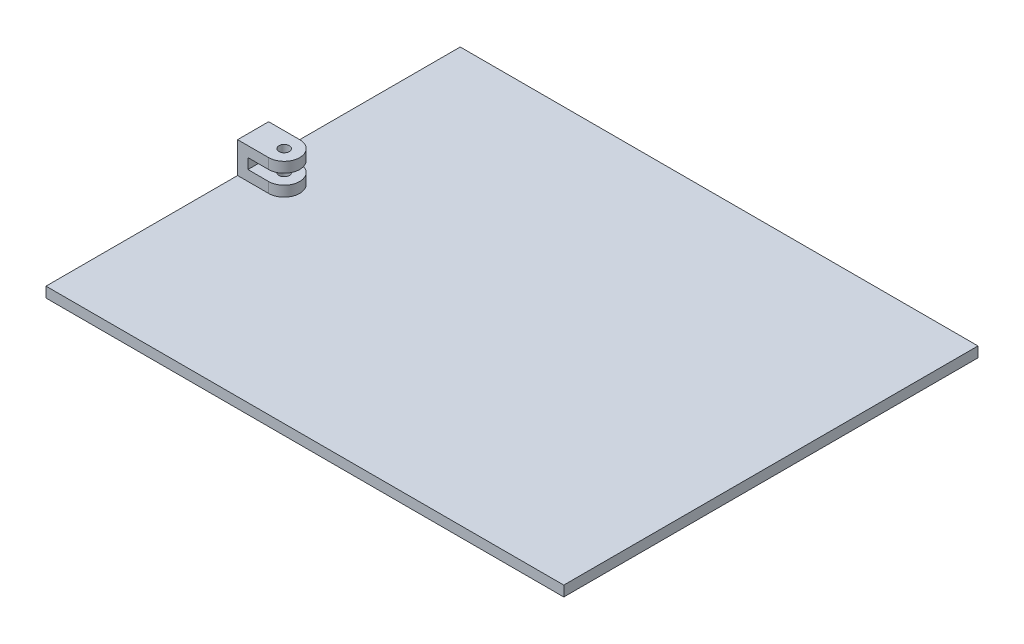
ISO-10303-21;
HEADER;
FILE_DESCRIPTION(('STEP AP214'),'2;1');
FILE_NAME('part.step','',(''),(''),'','','');
FILE_SCHEMA(('AUTOMOTIVE_DESIGN { 1 0 10303 214 1 1 1 1 }'));
ENDSEC;
DATA;
#1=APPLICATION_CONTEXT('core data for automotive mechanical design processes');
#2=APPLICATION_PROTOCOL_DEFINITION('international standard','automotive_design',2000,#1);
#3=PRODUCT_CONTEXT('',#1,'mechanical');
#4=PRODUCT('Part','Part','',(#3));
#5=PRODUCT_RELATED_PRODUCT_CATEGORY('part','',(#4));
#6=PRODUCT_DEFINITION_FORMATION('','',#4);
#7=PRODUCT_DEFINITION_CONTEXT('part definition',#1,'design');
#8=PRODUCT_DEFINITION('design','',#6,#7);
#9=PRODUCT_DEFINITION_SHAPE('','',#8);
#10=(LENGTH_UNIT() NAMED_UNIT(*) SI_UNIT(.MILLI.,.METRE.));
#11=(NAMED_UNIT(*) PLANE_ANGLE_UNIT() SI_UNIT($,.RADIAN.));
#12=(NAMED_UNIT(*) SI_UNIT($,.STERADIAN.) SOLID_ANGLE_UNIT());
#13=UNCERTAINTY_MEASURE_WITH_UNIT(LENGTH_MEASURE(1.E-05),#10,'distance_accuracy_value','');
#14=(GEOMETRIC_REPRESENTATION_CONTEXT(3) GLOBAL_UNCERTAINTY_ASSIGNED_CONTEXT((#13)) GLOBAL_UNIT_ASSIGNED_CONTEXT((#10,
#11,#12)) REPRESENTATION_CONTEXT('',''));
#15=CARTESIAN_POINT('',(0.,0.,0.));
#16=DIRECTION('',(0.,0.,1.));
#17=DIRECTION('',(1.,0.,0.));
#18=AXIS2_PLACEMENT_3D('',#15,#16,#17);
#19=CARTESIAN_POINT('',(0.,-10.,0.));
#20=DIRECTION('',(0.,1.,0.));
#21=DIRECTION('',(0.,0.,1.));
#22=AXIS2_PLACEMENT_3D('',#19,#20,#21);
#23=CYLINDRICAL_SURFACE('',#22,15.);
#24=CARTESIAN_POINT('',(0.,0.,0.));
#25=DIRECTION('',(0.,1.,0.));
#26=DIRECTION('',(0.,0.,1.));
#27=AXIS2_PLACEMENT_3D('',#24,#25,#26);
#28=CIRCLE('',#27,15.);
#29=CARTESIAN_POINT('',(0.,0.,15.));
#30=VERTEX_POINT('',#29);
#31=CARTESIAN_POINT('',(0.,0.,-15.));
#32=VERTEX_POINT('',#31);
#33=EDGE_CURVE('E199',#30,#32,#28,.T.);
#34=ORIENTED_EDGE('',*,*,#33,.F.);
#35=DIRECTION('',(0.,1.,0.));
#36=VECTOR('',#35,1.);
#37=CARTESIAN_POINT('',(0.,-10.,15.));
#38=LINE('',#37,#36);
#39=CARTESIAN_POINT('',(0.,-10.,15.));
#40=VERTEX_POINT('',#39);
#41=EDGE_CURVE('E11',#40,#30,#38,.T.);
#42=ORIENTED_EDGE('',*,*,#41,.F.);
#43=CARTESIAN_POINT('',(0.,-10.,0.));
#44=DIRECTION('',(0.,1.,0.));
#45=DIRECTION('',(0.,0.,1.));
#46=AXIS2_PLACEMENT_3D('',#43,#44,#45);
#47=CIRCLE('',#46,15.);
#48=CARTESIAN_POINT('',(0.,-10.,-15.));
#49=VERTEX_POINT('',#48);
#50=EDGE_CURVE('E202',#40,#49,#47,.T.);
#51=ORIENTED_EDGE('',*,*,#50,.T.);
#52=DIRECTION('',(0.,1.,0.));
#53=VECTOR('',#52,1.);
#54=CARTESIAN_POINT('',(0.,-10.,-15.));
#55=LINE('',#54,#53);
#56=EDGE_CURVE('E35',#49,#32,#55,.T.);
#57=ORIENTED_EDGE('',*,*,#56,.T.);
#58=EDGE_LOOP('',(#34,#42,#51,#57));
#59=FACE_BOUND('',#58,.T.);
#60=ADVANCED_FACE('F32',(#59),#23,.T.);
#61=CARTESIAN_POINT('',(-20.,-10.,15.));
#62=DIRECTION('',(0.,0.,1.));
#63=DIRECTION('',(1.,0.,0.));
#64=AXIS2_PLACEMENT_3D('',#61,#62,#63);
#65=PLANE('',#64);
#66=DIRECTION('',(1.,0.,0.));
#67=VECTOR('',#66,1.);
#68=CARTESIAN_POINT('',(-20.,0.,15.));
#69=LINE('',#68,#67);
#70=CARTESIAN_POINT('',(-30.,0.,15.));
#71=VERTEX_POINT('',#70);
#72=EDGE_CURVE('E205',#71,#30,#69,.T.);
#73=ORIENTED_EDGE('',*,*,#72,.F.);
#74=DIRECTION('',(0.,1.,0.));
#75=VECTOR('',#74,1.);
#76=CARTESIAN_POINT('',(-30.,0.,15.));
#77=LINE('',#76,#75);
#78=CARTESIAN_POINT('',(-30.,-30.,15.));
#79=VERTEX_POINT('',#78);
#80=EDGE_CURVE('E179',#79,#71,#77,.T.);
#81=ORIENTED_EDGE('',*,*,#80,.F.);
#82=DIRECTION('',(1.,0.,0.));
#83=VECTOR('',#82,1.);
#84=CARTESIAN_POINT('',(-30.,-30.,15.));
#85=LINE('',#84,#83);
#86=CARTESIAN_POINT('',(0.,-30.,15.));
#87=VERTEX_POINT('',#86);
#88=EDGE_CURVE('E187',#79,#87,#85,.T.);
#89=ORIENTED_EDGE('',*,*,#88,.T.);
#90=DIRECTION('',(0.,-1.,0.));
#91=VECTOR('',#90,1.);
#92=CARTESIAN_POINT('',(0.,-20.,15.));
#93=LINE('',#92,#91);
#94=CARTESIAN_POINT('',(0.,-20.,15.));
#95=VERTEX_POINT('',#94);
#96=EDGE_CURVE('E170',#95,#87,#93,.T.);
#97=ORIENTED_EDGE('',*,*,#96,.F.);
#98=DIRECTION('',(1.,0.,0.));
#99=VECTOR('',#98,1.);
#100=CARTESIAN_POINT('',(-20.,-20.,15.));
#101=LINE('',#100,#99);
#102=CARTESIAN_POINT('',(-20.,-20.,15.));
#103=VERTEX_POINT('',#102);
#104=EDGE_CURVE('E46',#103,#95,#101,.T.);
#105=ORIENTED_EDGE('',*,*,#104,.F.);
#106=DIRECTION('',(0.,1.,0.));
#107=VECTOR('',#106,1.);
#108=CARTESIAN_POINT('',(-20.,0.,15.));
#109=LINE('',#108,#107);
#110=CARTESIAN_POINT('',(-20.,-10.,15.));
#111=VERTEX_POINT('',#110);
#112=EDGE_CURVE('E178',#103,#111,#109,.T.);
#113=ORIENTED_EDGE('',*,*,#112,.T.);
#114=DIRECTION('',(1.,0.,0.));
#115=VECTOR('',#114,1.);
#116=CARTESIAN_POINT('',(-20.,-10.,15.));
#117=LINE('',#116,#115);
#118=EDGE_CURVE('E210',#111,#40,#117,.T.);
#119=ORIENTED_EDGE('',*,*,#118,.T.);
#120=ORIENTED_EDGE('',*,*,#41,.T.);
#121=EDGE_LOOP('',(#73,#81,#89,#97,#105,#113,#119,#120));
#122=FACE_BOUND('',#121,.T.);
#123=ADVANCED_FACE('F221',(#122),#65,.T.);
#124=CARTESIAN_POINT('',(0.,-10.,-15.));
#125=DIRECTION('',(0.,0.,-1.));
#126=DIRECTION('',(-1.,0.,0.));
#127=AXIS2_PLACEMENT_3D('',#124,#125,#126);
#128=PLANE('',#127);
#129=DIRECTION('',(-1.,0.,0.));
#130=VECTOR('',#129,1.);
#131=CARTESIAN_POINT('',(0.,0.,-15.));
#132=LINE('',#131,#130);
#133=CARTESIAN_POINT('',(-30.,0.,-15.));
#134=VERTEX_POINT('',#133);
#135=EDGE_CURVE('E214',#32,#134,#132,.T.);
#136=ORIENTED_EDGE('',*,*,#135,.F.);
#137=ORIENTED_EDGE('',*,*,#56,.F.);
#138=DIRECTION('',(-1.,0.,0.));
#139=VECTOR('',#138,1.);
#140=CARTESIAN_POINT('',(0.,-10.,-15.));
#141=LINE('',#140,#139);
#142=CARTESIAN_POINT('',(-20.,-10.,-15.));
#143=VERTEX_POINT('',#142);
#144=EDGE_CURVE('E204',#49,#143,#141,.T.);
#145=ORIENTED_EDGE('',*,*,#144,.T.);
#146=DIRECTION('',(0.,-1.,0.));
#147=VECTOR('',#146,1.);
#148=CARTESIAN_POINT('',(-20.,0.,-15.));
#149=LINE('',#148,#147);
#150=CARTESIAN_POINT('',(-20.,-20.,-15.));
#151=VERTEX_POINT('',#150);
#152=EDGE_CURVE('E182',#143,#151,#149,.T.);
#153=ORIENTED_EDGE('',*,*,#152,.T.);
#154=DIRECTION('',(-1.,0.,0.));
#155=VECTOR('',#154,1.);
#156=CARTESIAN_POINT('',(0.,-20.,-15.));
#157=LINE('',#156,#155);
#158=CARTESIAN_POINT('',(0.,-20.,-15.));
#159=VERTEX_POINT('',#158);
#160=EDGE_CURVE('E165',#159,#151,#157,.T.);
#161=ORIENTED_EDGE('',*,*,#160,.F.);
#162=DIRECTION('',(0.,-1.,0.));
#163=VECTOR('',#162,1.);
#164=CARTESIAN_POINT('',(0.,-20.,-15.));
#165=LINE('',#164,#163);
#166=CARTESIAN_POINT('',(0.,-30.,-15.));
#167=VERTEX_POINT('',#166);
#168=EDGE_CURVE('E175',#159,#167,#165,.T.);
#169=ORIENTED_EDGE('',*,*,#168,.T.);
#170=DIRECTION('',(1.,0.,0.));
#171=VECTOR('',#170,1.);
#172=CARTESIAN_POINT('',(-30.,-30.,-15.));
#173=LINE('',#172,#171);
#174=CARTESIAN_POINT('',(-30.,-30.,-15.));
#175=VERTEX_POINT('',#174);
#176=EDGE_CURVE('E193',#175,#167,#173,.T.);
#177=ORIENTED_EDGE('',*,*,#176,.F.);
#178=DIRECTION('',(0.,-1.,0.));
#179=VECTOR('',#178,1.);
#180=CARTESIAN_POINT('',(-30.,0.,-15.));
#181=LINE('',#180,#179);
#182=EDGE_CURVE('E185',#134,#175,#181,.T.);
#183=ORIENTED_EDGE('',*,*,#182,.F.);
#184=EDGE_LOOP('',(#136,#137,#145,#153,#161,#169,#177,#183));
#185=FACE_BOUND('',#184,.T.);
#186=ADVANCED_FACE('F258',(#185),#128,.T.);
#187=CARTESIAN_POINT('',(0.,-10.,0.));
#188=DIRECTION('',(0.,1.,0.));
#189=DIRECTION('',(0.,0.,1.));
#190=AXIS2_PLACEMENT_3D('',#187,#188,#189);
#191=PLANE('',#190);
#192=CARTESIAN_POINT('',(0.,-10.,0.));
#193=DIRECTION('',(0.,1.,0.));
#194=DIRECTION('',(0.,0.,1.));
#195=AXIS2_PLACEMENT_3D('',#192,#193,#194);
#196=CIRCLE('',#195,5.);
#197=CARTESIAN_POINT('',(0.,-10.,5.));
#198=VERTEX_POINT('',#197);
#199=EDGE_CURVE('E196',#198,#198,#196,.T.);
#200=ORIENTED_EDGE('',*,*,#199,.T.);
#201=EDGE_LOOP('',(#200));
#202=FACE_BOUND('',#201,.T.);
#203=ORIENTED_EDGE('',*,*,#50,.F.);
#204=ORIENTED_EDGE('',*,*,#118,.F.);
#205=DIRECTION('',(0.,0.,1.));
#206=VECTOR('',#205,1.);
#207=CARTESIAN_POINT('',(-20.,-10.,-15.));
#208=LINE('',#207,#206);
#209=EDGE_CURVE('E207',#143,#111,#208,.T.);
#210=ORIENTED_EDGE('',*,*,#209,.F.);
#211=ORIENTED_EDGE('',*,*,#144,.F.);
#212=EDGE_LOOP('',(#203,#204,#210,#211));
#213=FACE_BOUND('',#212,.T.);
#214=ADVANCED_FACE('F275',(#202,#213),#191,.F.);
#215=CARTESIAN_POINT('',(0.,0.,0.));
#216=DIRECTION('',(0.,1.,0.));
#217=DIRECTION('',(0.,0.,1.));
#218=AXIS2_PLACEMENT_3D('',#215,#216,#217);
#219=PLANE('',#218);
#220=CARTESIAN_POINT('',(0.,0.,0.));
#221=DIRECTION('',(0.,1.,0.));
#222=DIRECTION('',(0.,0.,1.));
#223=AXIS2_PLACEMENT_3D('',#220,#221,#222);
#224=CIRCLE('',#223,5.);
#225=CARTESIAN_POINT('',(0.,0.,5.));
#226=VERTEX_POINT('',#225);
#227=EDGE_CURVE('E195',#226,#226,#224,.T.);
#228=ORIENTED_EDGE('',*,*,#227,.F.);
#229=EDGE_LOOP('',(#228));
#230=FACE_BOUND('',#229,.T.);
#231=ORIENTED_EDGE('',*,*,#33,.T.);
#232=ORIENTED_EDGE('',*,*,#135,.T.);
#233=DIRECTION('',(0.,0.,-1.));
#234=VECTOR('',#233,1.);
#235=CARTESIAN_POINT('',(-30.,0.,15.));
#236=LINE('',#235,#234);
#237=EDGE_CURVE('E181',#71,#134,#236,.T.);
#238=ORIENTED_EDGE('',*,*,#237,.F.);
#239=ORIENTED_EDGE('',*,*,#72,.T.);
#240=EDGE_LOOP('',(#231,#232,#238,#239));
#241=FACE_BOUND('',#240,.T.);
#242=ADVANCED_FACE('F219',(#230,#241),#219,.T.);
#243=CARTESIAN_POINT('',(0.,-10.,0.));
#244=DIRECTION('',(0.,1.,0.));
#245=DIRECTION('',(0.,0.,1.));
#246=AXIS2_PLACEMENT_3D('',#243,#244,#245);
#247=CYLINDRICAL_SURFACE('',#246,5.);
#248=ORIENTED_EDGE('',*,*,#199,.F.);
#249=EDGE_LOOP('',(#248));
#250=FACE_BOUND('',#249,.T.);
#251=ORIENTED_EDGE('',*,*,#227,.T.);
#252=EDGE_LOOP('',(#251));
#253=FACE_BOUND('',#252,.T.);
#254=ADVANCED_FACE('F283',(#250,#253),#247,.F.);
#255=CARTESIAN_POINT('',(-30.,0.,0.));
#256=DIRECTION('',(1.,0.,0.));
#257=DIRECTION('',(0.,0.,-1.));
#258=AXIS2_PLACEMENT_3D('',#255,#256,#257);
#259=PLANE('',#258);
#260=ORIENTED_EDGE('',*,*,#80,.T.);
#261=ORIENTED_EDGE('',*,*,#237,.T.);
#262=ORIENTED_EDGE('',*,*,#182,.T.);
#263=DIRECTION('',(0.,0.,-1.));
#264=VECTOR('',#263,1.);
#265=CARTESIAN_POINT('',(-30.,-30.,-200.));
#266=LINE('',#265,#264);
#267=CARTESIAN_POINT('',(-30.,-30.,-200.));
#268=VERTEX_POINT('',#267);
#269=EDGE_CURVE('E148',#175,#268,#266,.T.);
#270=ORIENTED_EDGE('',*,*,#269,.T.);
#271=DIRECTION('',(0.,1.,0.));
#272=VECTOR('',#271,1.);
#273=CARTESIAN_POINT('',(-30.,-40.,-200.));
#274=LINE('',#273,#272);
#275=CARTESIAN_POINT('',(-30.,-40.,-200.));
#276=VERTEX_POINT('',#275);
#277=EDGE_CURVE('E128',#276,#268,#274,.T.);
#278=ORIENTED_EDGE('',*,*,#277,.F.);
#279=DIRECTION('',(0.,0.,-1.));
#280=VECTOR('',#279,1.);
#281=CARTESIAN_POINT('',(-30.,-40.,-200.));
#282=LINE('',#281,#280);
#283=CARTESIAN_POINT('',(-30.,-40.,200.));
#284=VERTEX_POINT('',#283);
#285=EDGE_CURVE('E134',#284,#276,#282,.T.);
#286=ORIENTED_EDGE('',*,*,#285,.F.);
#287=DIRECTION('',(0.,1.,0.));
#288=VECTOR('',#287,1.);
#289=CARTESIAN_POINT('',(-30.,-40.,200.));
#290=LINE('',#289,#288);
#291=CARTESIAN_POINT('',(-30.,-30.,200.));
#292=VERTEX_POINT('',#291);
#293=EDGE_CURVE('E226',#284,#292,#290,.T.);
#294=ORIENTED_EDGE('',*,*,#293,.T.);
#295=EDGE_CURVE('E225',#292,#79,#266,.T.);
#296=ORIENTED_EDGE('',*,*,#295,.T.);
#297=EDGE_LOOP('',(#260,#261,#262,#270,#278,#286,#294,#296));
#298=FACE_BOUND('',#297,.T.);
#299=ADVANCED_FACE('F146',(#298),#259,.F.);
#300=CARTESIAN_POINT('',(-20.,0.,0.));
#301=DIRECTION('',(1.,0.,0.));
#302=DIRECTION('',(0.,0.,-1.));
#303=AXIS2_PLACEMENT_3D('',#300,#301,#302);
#304=PLANE('',#303);
#305=DIRECTION('',(0.,0.,1.));
#306=VECTOR('',#305,1.);
#307=CARTESIAN_POINT('',(-20.,-20.,-15.));
#308=LINE('',#307,#306);
#309=EDGE_CURVE('E167',#151,#103,#308,.T.);
#310=ORIENTED_EDGE('',*,*,#309,.F.);
#311=ORIENTED_EDGE('',*,*,#152,.F.);
#312=ORIENTED_EDGE('',*,*,#209,.T.);
#313=ORIENTED_EDGE('',*,*,#112,.F.);
#314=EDGE_LOOP('',(#310,#311,#312,#313));
#315=FACE_BOUND('',#314,.T.);
#316=ADVANCED_FACE('F272',(#315),#304,.T.);
#317=CARTESIAN_POINT('',(0.,-20.,0.));
#318=DIRECTION('',(0.,1.,0.));
#319=DIRECTION('',(0.,0.,1.));
#320=AXIS2_PLACEMENT_3D('',#317,#318,#319);
#321=PLANE('',#320);
#322=CARTESIAN_POINT('',(0.,-20.,0.));
#323=DIRECTION('',(0.,1.,0.));
#324=DIRECTION('',(0.,0.,1.));
#325=AXIS2_PLACEMENT_3D('',#322,#323,#324);
#326=CIRCLE('',#325,15.);
#327=EDGE_CURVE('E162',#95,#159,#326,.T.);
#328=ORIENTED_EDGE('',*,*,#327,.T.);
#329=ORIENTED_EDGE('',*,*,#160,.T.);
#330=ORIENTED_EDGE('',*,*,#309,.T.);
#331=ORIENTED_EDGE('',*,*,#104,.T.);
#332=EDGE_LOOP('',(#328,#329,#330,#331));
#333=FACE_BOUND('',#332,.T.);
#334=CARTESIAN_POINT('',(0.,-20.,0.));
#335=DIRECTION('',(0.,1.,0.));
#336=DIRECTION('',(0.,0.,1.));
#337=AXIS2_PLACEMENT_3D('',#334,#335,#336);
#338=CIRCLE('',#337,5.);
#339=CARTESIAN_POINT('',(0.,-20.,5.));
#340=VERTEX_POINT('',#339);
#341=EDGE_CURVE('E153',#340,#340,#338,.T.);
#342=ORIENTED_EDGE('',*,*,#341,.F.);
#343=EDGE_LOOP('',(#342));
#344=FACE_BOUND('',#343,.T.);
#345=ADVANCED_FACE('F266',(#333,#344),#321,.T.);
#346=CARTESIAN_POINT('',(0.,-20.,0.));
#347=DIRECTION('',(0.,-1.,0.));
#348=DIRECTION('',(0.,0.,-1.));
#349=AXIS2_PLACEMENT_3D('',#346,#347,#348);
#350=CYLINDRICAL_SURFACE('',#349,15.);
#351=CARTESIAN_POINT('',(0.,-30.,0.));
#352=DIRECTION('',(0.,1.,0.));
#353=DIRECTION('',(0.,0.,1.));
#354=AXIS2_PLACEMENT_3D('',#351,#352,#353);
#355=CIRCLE('',#354,15.);
#356=EDGE_CURVE('E160',#87,#167,#355,.T.);
#357=ORIENTED_EDGE('',*,*,#356,.T.);
#358=ORIENTED_EDGE('',*,*,#168,.F.);
#359=ORIENTED_EDGE('',*,*,#327,.F.);
#360=ORIENTED_EDGE('',*,*,#96,.T.);
#361=EDGE_LOOP('',(#357,#358,#359,#360));
#362=FACE_BOUND('',#361,.T.);
#363=ADVANCED_FACE('F263',(#362),#350,.T.);
#364=CARTESIAN_POINT('',(0.,-20.,0.));
#365=DIRECTION('',(0.,-1.,0.));
#366=DIRECTION('',(0.,0.,-1.));
#367=AXIS2_PLACEMENT_3D('',#364,#365,#366);
#368=CYLINDRICAL_SURFACE('',#367,5.);
#369=ORIENTED_EDGE('',*,*,#341,.T.);
#370=EDGE_LOOP('',(#369));
#371=FACE_BOUND('',#370,.T.);
#372=CARTESIAN_POINT('',(0.,-30.,0.));
#373=DIRECTION('',(0.,1.,0.));
#374=DIRECTION('',(0.,0.,1.));
#375=AXIS2_PLACEMENT_3D('',#372,#373,#374);
#376=CIRCLE('',#375,5.);
#377=CARTESIAN_POINT('',(0.,-30.,5.));
#378=VERTEX_POINT('',#377);
#379=EDGE_CURVE('E150',#378,#378,#376,.T.);
#380=ORIENTED_EDGE('',*,*,#379,.F.);
#381=EDGE_LOOP('',(#380));
#382=FACE_BOUND('',#381,.T.);
#383=ADVANCED_FACE('F296',(#371,#382),#368,.F.);
#384=CARTESIAN_POINT('',(0.,-30.,0.));
#385=DIRECTION('',(0.,1.,0.));
#386=DIRECTION('',(0.,0.,1.));
#387=AXIS2_PLACEMENT_3D('',#384,#385,#386);
#388=PLANE('',#387);
#389=ORIENTED_EDGE('',*,*,#379,.T.);
#390=EDGE_LOOP('',(#389));
#391=FACE_BOUND('',#390,.T.);
#392=ADVANCED_FACE('F300',(#391),#388,.T.);
#393=ORIENTED_EDGE('',*,*,#269,.F.);
#394=ORIENTED_EDGE('',*,*,#176,.T.);
#395=ORIENTED_EDGE('',*,*,#356,.F.);
#396=ORIENTED_EDGE('',*,*,#88,.F.);
#397=ORIENTED_EDGE('',*,*,#295,.F.);
#398=DIRECTION('',(-1.,0.,0.));
#399=VECTOR('',#398,1.);
#400=CARTESIAN_POINT('',(-30.,-30.,200.));
#401=LINE('',#400,#399);
#402=CARTESIAN_POINT('',(470.,-30.,200.));
#403=VERTEX_POINT('',#402);
#404=EDGE_CURVE('E143',#403,#292,#401,.T.);
#405=ORIENTED_EDGE('',*,*,#404,.F.);
#406=DIRECTION('',(0.,0.,1.));
#407=VECTOR('',#406,1.);
#408=CARTESIAN_POINT('',(470.,-30.,-200.));
#409=LINE('',#408,#407);
#410=CARTESIAN_POINT('',(470.,-30.,-200.));
#411=VERTEX_POINT('',#410);
#412=EDGE_CURVE('E231',#411,#403,#409,.T.);
#413=ORIENTED_EDGE('',*,*,#412,.F.);
#414=DIRECTION('',(1.,0.,0.));
#415=VECTOR('',#414,1.);
#416=CARTESIAN_POINT('',(-30.,-30.,-200.));
#417=LINE('',#416,#415);
#418=EDGE_CURVE('E229',#268,#411,#417,.T.);
#419=ORIENTED_EDGE('',*,*,#418,.F.);
#420=EDGE_LOOP('',(#393,#394,#395,#396,#397,#405,#413,#419));
#421=FACE_BOUND('',#420,.T.);
#422=ADVANCED_FACE('F244',(#421),#388,.T.);
#423=CARTESIAN_POINT('',(-30.,-40.,-200.));
#424=DIRECTION('',(0.,0.,1.));
#425=DIRECTION('',(0.,-1.,0.));
#426=AXIS2_PLACEMENT_3D('',#423,#424,#425);
#427=PLANE('',#426);
#428=ORIENTED_EDGE('',*,*,#418,.T.);
#429=DIRECTION('',(0.,1.,0.));
#430=VECTOR('',#429,1.);
#431=CARTESIAN_POINT('',(470.,-40.,-200.));
#432=LINE('',#431,#430);
#433=CARTESIAN_POINT('',(470.,-40.,-200.));
#434=VERTEX_POINT('',#433);
#435=EDGE_CURVE('E130',#434,#411,#432,.T.);
#436=ORIENTED_EDGE('',*,*,#435,.F.);
#437=DIRECTION('',(1.,0.,0.));
#438=VECTOR('',#437,1.);
#439=CARTESIAN_POINT('',(-30.,-40.,-200.));
#440=LINE('',#439,#438);
#441=EDGE_CURVE('E124',#276,#434,#440,.T.);
#442=ORIENTED_EDGE('',*,*,#441,.F.);
#443=ORIENTED_EDGE('',*,*,#277,.T.);
#444=EDGE_LOOP('',(#428,#436,#442,#443));
#445=FACE_BOUND('',#444,.T.);
#446=ADVANCED_FACE('F126',(#445),#427,.F.);
#447=CARTESIAN_POINT('',(470.,-40.,-200.));
#448=DIRECTION('',(-1.,0.,0.));
#449=DIRECTION('',(0.,0.,1.));
#450=AXIS2_PLACEMENT_3D('',#447,#448,#449);
#451=PLANE('',#450);
#452=ORIENTED_EDGE('',*,*,#412,.T.);
#453=DIRECTION('',(0.,1.,0.));
#454=VECTOR('',#453,1.);
#455=CARTESIAN_POINT('',(470.,-40.,200.));
#456=LINE('',#455,#454);
#457=CARTESIAN_POINT('',(470.,-40.,200.));
#458=VERTEX_POINT('',#457);
#459=EDGE_CURVE('E155',#458,#403,#456,.T.);
#460=ORIENTED_EDGE('',*,*,#459,.F.);
#461=DIRECTION('',(0.,0.,1.));
#462=VECTOR('',#461,1.);
#463=CARTESIAN_POINT('',(470.,-40.,-200.));
#464=LINE('',#463,#462);
#465=EDGE_CURVE('E133',#434,#458,#464,.T.);
#466=ORIENTED_EDGE('',*,*,#465,.F.);
#467=ORIENTED_EDGE('',*,*,#435,.T.);
#468=EDGE_LOOP('',(#452,#460,#466,#467));
#469=FACE_BOUND('',#468,.T.);
#470=ADVANCED_FACE('F245',(#469),#451,.F.);
#471=CARTESIAN_POINT('',(-30.,-40.,200.));
#472=DIRECTION('',(0.,0.,-1.));
#473=DIRECTION('',(0.,1.,0.));
#474=AXIS2_PLACEMENT_3D('',#471,#472,#473);
#475=PLANE('',#474);
#476=ORIENTED_EDGE('',*,*,#404,.T.);
#477=ORIENTED_EDGE('',*,*,#293,.F.);
#478=DIRECTION('',(-1.,0.,0.));
#479=VECTOR('',#478,1.);
#480=CARTESIAN_POINT('',(-30.,-40.,200.));
#481=LINE('',#480,#479);
#482=EDGE_CURVE('E139',#458,#284,#481,.T.);
#483=ORIENTED_EDGE('',*,*,#482,.F.);
#484=ORIENTED_EDGE('',*,*,#459,.T.);
#485=EDGE_LOOP('',(#476,#477,#483,#484));
#486=FACE_BOUND('',#485,.T.);
#487=ADVANCED_FACE('F241',(#486),#475,.F.);
#488=CARTESIAN_POINT('',(0.,-40.,0.));
#489=DIRECTION('',(0.,1.,0.));
#490=DIRECTION('',(0.,0.,1.));
#491=AXIS2_PLACEMENT_3D('',#488,#489,#490);
#492=PLANE('',#491);
#493=ORIENTED_EDGE('',*,*,#285,.T.);
#494=ORIENTED_EDGE('',*,*,#441,.T.);
#495=ORIENTED_EDGE('',*,*,#465,.T.);
#496=ORIENTED_EDGE('',*,*,#482,.T.);
#497=EDGE_LOOP('',(#493,#494,#495,#496));
#498=FACE_BOUND('',#497,.T.);
#499=ADVANCED_FACE('F137',(#498),#492,.F.);
#500=CLOSED_SHELL('',(#60,#123,#186,#214,#242,#254,#299,#316,#345,#363,#383,#392,#422,#446,#470,
#487,#499));
#501=MANIFOLD_SOLID_BREP('B2',#500);
#502=ADVANCED_BREP_SHAPE_REPRESENTATION('',(#18,#501),#14);
#503=SHAPE_DEFINITION_REPRESENTATION(#9,#502);
ENDSEC;
END-ISO-10303-21;
